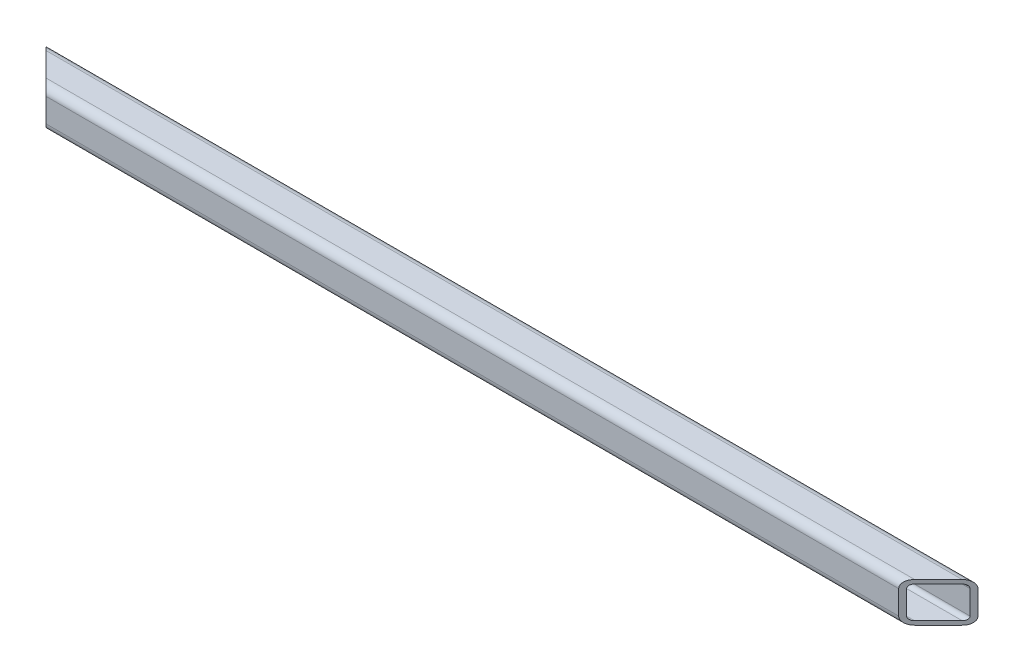
ISO-10303-21;
HEADER;
FILE_DESCRIPTION(('STEP AP214'),'2;1');
FILE_NAME('part.step','',(''),(''),'','','');
FILE_SCHEMA(('AUTOMOTIVE_DESIGN { 1 0 10303 214 1 1 1 1 }'));
ENDSEC;
DATA;
#1=APPLICATION_CONTEXT('core data for automotive mechanical design processes');
#2=APPLICATION_PROTOCOL_DEFINITION('international standard','automotive_design',2000,#1);
#3=PRODUCT_CONTEXT('',#1,'mechanical');
#4=PRODUCT('Part','Part','',(#3));
#5=PRODUCT_RELATED_PRODUCT_CATEGORY('part','',(#4));
#6=PRODUCT_DEFINITION_FORMATION('','',#4);
#7=PRODUCT_DEFINITION_CONTEXT('part definition',#1,'design');
#8=PRODUCT_DEFINITION('design','',#6,#7);
#9=PRODUCT_DEFINITION_SHAPE('','',#8);
#10=(LENGTH_UNIT() NAMED_UNIT(*) SI_UNIT(.MILLI.,.METRE.));
#11=(NAMED_UNIT(*) PLANE_ANGLE_UNIT() SI_UNIT($,.RADIAN.));
#12=(NAMED_UNIT(*) SI_UNIT($,.STERADIAN.) SOLID_ANGLE_UNIT());
#13=UNCERTAINTY_MEASURE_WITH_UNIT(LENGTH_MEASURE(1.E-05),#10,'distance_accuracy_value','');
#14=(GEOMETRIC_REPRESENTATION_CONTEXT(3) GLOBAL_UNCERTAINTY_ASSIGNED_CONTEXT((#13)) GLOBAL_UNIT_ASSIGNED_CONTEXT((#10,
#11,#12)) REPRESENTATION_CONTEXT('',''));
#15=CARTESIAN_POINT('',(0.,0.,0.));
#16=DIRECTION('',(0.,0.,1.));
#17=DIRECTION('',(1.,0.,0.));
#18=AXIS2_PLACEMENT_3D('',#15,#16,#17);
#19=CARTESIAN_POINT('',(225.,206.,-456.));
#20=DIRECTION('',(-1.,0.,0.));
#21=DIRECTION('',(0.,0.,1.));
#22=AXIS2_PLACEMENT_3D('',#19,#20,#21);
#23=CYLINDRICAL_SURFACE('',#22,4.);
#24=CARTESIAN_POINT('',(-231.,206.,-456.));
#25=DIRECTION('',(-0.707106781186548,0.,0.707106781186548));
#26=DIRECTION('',(-0.707106781186548,0.,-0.707106781186547));
#27=AXIS2_PLACEMENT_3D('',#24,#25,#26);
#28=ELLIPSE('',#27,5.65685424949239,4.);
#29=CARTESIAN_POINT('',(-231.,210.,-456.));
#30=VERTEX_POINT('',#29);
#31=CARTESIAN_POINT('',(-235.,206.,-460.));
#32=VERTEX_POINT('',#31);
#33=EDGE_CURVE('E185',#30,#32,#28,.T.);
#34=ORIENTED_EDGE('',*,*,#33,.F.);
#35=DIRECTION('',(-1.,0.,0.));
#36=VECTOR('',#35,1.);
#37=CARTESIAN_POINT('',(225.,210.,-456.));
#38=LINE('',#37,#36);
#39=CARTESIAN_POINT('',(231.,210.,-456.));
#40=VERTEX_POINT('',#39);
#41=EDGE_CURVE('E265',#40,#30,#38,.T.);
#42=ORIENTED_EDGE('',*,*,#41,.F.);
#43=CARTESIAN_POINT('',(231.,206.,-456.));
#44=DIRECTION('',(0.707106781186548,0.,0.707106781186548));
#45=DIRECTION('',(-0.707106781186548,0.,0.707106781186548));
#46=AXIS2_PLACEMENT_3D('',#43,#44,#45);
#47=ELLIPSE('',#46,5.65685424949238,4.);
#48=CARTESIAN_POINT('',(235.,206.,-460.));
#49=VERTEX_POINT('',#48);
#50=EDGE_CURVE('E176',#49,#40,#47,.T.);
#51=ORIENTED_EDGE('',*,*,#50,.F.);
#52=DIRECTION('',(-1.,0.,0.));
#53=VECTOR('',#52,1.);
#54=CARTESIAN_POINT('',(225.,206.,-460.));
#55=LINE('',#54,#53);
#56=EDGE_CURVE('E45',#49,#32,#55,.T.);
#57=ORIENTED_EDGE('',*,*,#56,.T.);
#58=EDGE_LOOP('',(#34,#42,#51,#57));
#59=FACE_BOUND('',#58,.T.);
#60=ADVANCED_FACE('F41',(#59),#23,.T.);
#61=CARTESIAN_POINT('',(225.,210.,-456.));
#62=DIRECTION('',(0.,-1.,0.));
#63=DIRECTION('',(0.,0.,-1.));
#64=AXIS2_PLACEMENT_3D('',#61,#62,#63);
#65=PLANE('',#64);
#66=DIRECTION('',(-0.707106781186548,0.,-0.707106781186547));
#67=VECTOR('',#66,1.);
#68=CARTESIAN_POINT('',(-3.,210.,-228.));
#69=LINE('',#68,#67);
#70=CARTESIAN_POINT('',(-219.,210.,-444.));
#71=VERTEX_POINT('',#70);
#72=EDGE_CURVE('E182',#71,#30,#69,.T.);
#73=ORIENTED_EDGE('',*,*,#72,.F.);
#74=DIRECTION('',(-1.,0.,0.));
#75=VECTOR('',#74,1.);
#76=CARTESIAN_POINT('',(225.,210.,-444.));
#77=LINE('',#76,#75);
#78=CARTESIAN_POINT('',(219.,210.,-444.));
#79=VERTEX_POINT('',#78);
#80=EDGE_CURVE('E263',#79,#71,#77,.T.);
#81=ORIENTED_EDGE('',*,*,#80,.F.);
#82=DIRECTION('',(-0.707106781186548,0.,0.707106781186548));
#83=VECTOR('',#82,1.);
#84=CARTESIAN_POINT('',(228.,210.,-453.));
#85=LINE('',#84,#83);
#86=EDGE_CURVE('E281',#40,#79,#85,.T.);
#87=ORIENTED_EDGE('',*,*,#86,.F.);
#88=ORIENTED_EDGE('',*,*,#41,.T.);
#89=EDGE_LOOP('',(#73,#81,#87,#88));
#90=FACE_BOUND('',#89,.T.);
#91=ADVANCED_FACE('F272',(#90),#65,.F.);
#92=CARTESIAN_POINT('',(225.,206.,-444.));
#93=DIRECTION('',(-1.,0.,0.));
#94=DIRECTION('',(0.,0.,1.));
#95=AXIS2_PLACEMENT_3D('',#92,#93,#94);
#96=CYLINDRICAL_SURFACE('',#95,4.);
#97=CARTESIAN_POINT('',(-219.,206.,-444.));
#98=DIRECTION('',(-0.707106781186548,0.,0.707106781186548));
#99=DIRECTION('',(-0.707106781186548,0.,-0.707106781186547));
#100=AXIS2_PLACEMENT_3D('',#97,#98,#99);
#101=ELLIPSE('',#100,5.65685424949239,4.);
#102=CARTESIAN_POINT('',(-215.,206.,-440.));
#103=VERTEX_POINT('',#102);
#104=EDGE_CURVE('E11',#103,#71,#101,.T.);
#105=ORIENTED_EDGE('',*,*,#104,.F.);
#106=DIRECTION('',(-1.,0.,0.));
#107=VECTOR('',#106,1.);
#108=CARTESIAN_POINT('',(225.,206.,-440.));
#109=LINE('',#108,#107);
#110=CARTESIAN_POINT('',(215.,206.,-440.));
#111=VERTEX_POINT('',#110);
#112=EDGE_CURVE('E260',#111,#103,#109,.T.);
#113=ORIENTED_EDGE('',*,*,#112,.F.);
#114=CARTESIAN_POINT('',(219.,206.,-444.));
#115=DIRECTION('',(0.707106781186548,0.,0.707106781186548));
#116=DIRECTION('',(-0.707106781186548,0.,0.707106781186548));
#117=AXIS2_PLACEMENT_3D('',#114,#115,#116);
#118=ELLIPSE('',#117,5.65685424949238,4.);
#119=EDGE_CURVE('E278',#79,#111,#118,.T.);
#120=ORIENTED_EDGE('',*,*,#119,.F.);
#121=ORIENTED_EDGE('',*,*,#80,.T.);
#122=EDGE_LOOP('',(#105,#113,#120,#121));
#123=FACE_BOUND('',#122,.T.);
#124=ADVANCED_FACE('F275',(#123),#96,.T.);
#125=CARTESIAN_POINT('',(225.,194.,-440.));
#126=DIRECTION('',(0.,0.,-1.));
#127=DIRECTION('',(-1.,0.,0.));
#128=AXIS2_PLACEMENT_3D('',#125,#126,#127);
#129=PLANE('',#128);
#130=DIRECTION('',(0.,1.,0.));
#131=VECTOR('',#130,1.);
#132=CARTESIAN_POINT('',(-215.,194.,-440.));
#133=LINE('',#132,#131);
#134=CARTESIAN_POINT('',(-215.,194.,-440.));
#135=VERTEX_POINT('',#134);
#136=EDGE_CURVE('E51',#135,#103,#133,.T.);
#137=ORIENTED_EDGE('',*,*,#136,.F.);
#138=DIRECTION('',(-1.,0.,0.));
#139=VECTOR('',#138,1.);
#140=CARTESIAN_POINT('',(225.,194.,-440.));
#141=LINE('',#140,#139);
#142=CARTESIAN_POINT('',(215.,194.,-440.));
#143=VERTEX_POINT('',#142);
#144=EDGE_CURVE('E257',#143,#135,#141,.T.);
#145=ORIENTED_EDGE('',*,*,#144,.F.);
#146=DIRECTION('',(0.,-1.,0.));
#147=VECTOR('',#146,1.);
#148=CARTESIAN_POINT('',(215.,194.,-440.));
#149=LINE('',#148,#147);
#150=EDGE_CURVE('E280',#111,#143,#149,.T.);
#151=ORIENTED_EDGE('',*,*,#150,.F.);
#152=ORIENTED_EDGE('',*,*,#112,.T.);
#153=EDGE_LOOP('',(#137,#145,#151,#152));
#154=FACE_BOUND('',#153,.T.);
#155=ADVANCED_FACE('F291',(#154),#129,.F.);
#156=CARTESIAN_POINT('',(225.,194.,-444.));
#157=DIRECTION('',(-1.,0.,0.));
#158=DIRECTION('',(0.,0.,1.));
#159=AXIS2_PLACEMENT_3D('',#156,#157,#158);
#160=CYLINDRICAL_SURFACE('',#159,4.);
#161=CARTESIAN_POINT('',(-219.,194.,-444.));
#162=DIRECTION('',(-0.707106781186548,0.,0.707106781186548));
#163=DIRECTION('',(-0.707106781186548,0.,-0.707106781186547));
#164=AXIS2_PLACEMENT_3D('',#161,#162,#163);
#165=ELLIPSE('',#164,5.65685424949239,4.);
#166=CARTESIAN_POINT('',(-219.,190.,-444.));
#167=VERTEX_POINT('',#166);
#168=EDGE_CURVE('E200',#167,#135,#165,.T.);
#169=ORIENTED_EDGE('',*,*,#168,.F.);
#170=DIRECTION('',(-1.,0.,0.));
#171=VECTOR('',#170,1.);
#172=CARTESIAN_POINT('',(225.,190.,-444.));
#173=LINE('',#172,#171);
#174=CARTESIAN_POINT('',(219.,190.,-444.));
#175=VERTEX_POINT('',#174);
#176=EDGE_CURVE('E254',#175,#167,#173,.T.);
#177=ORIENTED_EDGE('',*,*,#176,.F.);
#178=CARTESIAN_POINT('',(219.,194.,-444.));
#179=DIRECTION('',(0.707106781186548,0.,0.707106781186548));
#180=DIRECTION('',(-0.707106781186548,0.,0.707106781186548));
#181=AXIS2_PLACEMENT_3D('',#178,#179,#180);
#182=ELLIPSE('',#181,5.65685424949238,4.);
#183=EDGE_CURVE('E187',#143,#175,#182,.T.);
#184=ORIENTED_EDGE('',*,*,#183,.F.);
#185=ORIENTED_EDGE('',*,*,#144,.T.);
#186=EDGE_LOOP('',(#169,#177,#184,#185));
#187=FACE_BOUND('',#186,.T.);
#188=ADVANCED_FACE('F289',(#187),#160,.T.);
#189=CARTESIAN_POINT('',(225.,190.,-444.));
#190=DIRECTION('',(0.,1.,0.));
#191=DIRECTION('',(0.,0.,1.));
#192=AXIS2_PLACEMENT_3D('',#189,#190,#191);
#193=PLANE('',#192);
#194=DIRECTION('',(0.707106781186548,0.,0.707106781186547));
#195=VECTOR('',#194,1.);
#196=CARTESIAN_POINT('',(2.99999999999997,190.,-222.));
#197=LINE('',#196,#195);
#198=CARTESIAN_POINT('',(-231.,190.,-456.));
#199=VERTEX_POINT('',#198);
#200=EDGE_CURVE('E203',#199,#167,#197,.T.);
#201=ORIENTED_EDGE('',*,*,#200,.F.);
#202=DIRECTION('',(-1.,0.,0.));
#203=VECTOR('',#202,1.);
#204=CARTESIAN_POINT('',(225.,190.,-456.));
#205=LINE('',#204,#203);
#206=CARTESIAN_POINT('',(231.,190.,-456.));
#207=VERTEX_POINT('',#206);
#208=EDGE_CURVE('E252',#207,#199,#205,.T.);
#209=ORIENTED_EDGE('',*,*,#208,.F.);
#210=DIRECTION('',(0.707106781186548,0.,-0.707106781186548));
#211=VECTOR('',#210,1.);
#212=CARTESIAN_POINT('',(222.,190.,-447.));
#213=LINE('',#212,#211);
#214=EDGE_CURVE('E181',#175,#207,#213,.T.);
#215=ORIENTED_EDGE('',*,*,#214,.F.);
#216=ORIENTED_EDGE('',*,*,#176,.T.);
#217=EDGE_LOOP('',(#201,#209,#215,#216));
#218=FACE_BOUND('',#217,.T.);
#219=ADVANCED_FACE('F293',(#218),#193,.F.);
#220=CARTESIAN_POINT('',(225.,194.,-456.));
#221=DIRECTION('',(-1.,0.,0.));
#222=DIRECTION('',(0.,0.,1.));
#223=AXIS2_PLACEMENT_3D('',#220,#221,#222);
#224=CYLINDRICAL_SURFACE('',#223,4.);
#225=CARTESIAN_POINT('',(-231.,194.,-456.));
#226=DIRECTION('',(-0.707106781186548,0.,0.707106781186548));
#227=DIRECTION('',(-0.707106781186548,0.,-0.707106781186547));
#228=AXIS2_PLACEMENT_3D('',#225,#226,#227);
#229=ELLIPSE('',#228,5.65685424949239,4.);
#230=CARTESIAN_POINT('',(-235.,194.,-460.));
#231=VERTEX_POINT('',#230);
#232=EDGE_CURVE('E164',#231,#199,#229,.T.);
#233=ORIENTED_EDGE('',*,*,#232,.F.);
#234=DIRECTION('',(-1.,0.,0.));
#235=VECTOR('',#234,1.);
#236=CARTESIAN_POINT('',(225.,194.,-460.));
#237=LINE('',#236,#235);
#238=CARTESIAN_POINT('',(235.,194.,-460.));
#239=VERTEX_POINT('',#238);
#240=EDGE_CURVE('E156',#239,#231,#237,.T.);
#241=ORIENTED_EDGE('',*,*,#240,.F.);
#242=CARTESIAN_POINT('',(231.,194.,-456.));
#243=DIRECTION('',(0.707106781186548,0.,0.707106781186548));
#244=DIRECTION('',(-0.707106781186548,0.,0.707106781186548));
#245=AXIS2_PLACEMENT_3D('',#242,#243,#244);
#246=ELLIPSE('',#245,5.65685424949238,4.);
#247=EDGE_CURVE('E161',#207,#239,#246,.T.);
#248=ORIENTED_EDGE('',*,*,#247,.F.);
#249=ORIENTED_EDGE('',*,*,#208,.T.);
#250=EDGE_LOOP('',(#233,#241,#248,#249));
#251=FACE_BOUND('',#250,.T.);
#252=ADVANCED_FACE('F158',(#251),#224,.T.);
#253=CARTESIAN_POINT('',(225.,206.,-444.));
#254=DIRECTION('',(-1.,0.,0.));
#255=DIRECTION('',(0.,0.,1.));
#256=AXIS2_PLACEMENT_3D('',#253,#254,#255);
#257=CYLINDRICAL_SURFACE('',#256,2.);
#258=DIRECTION('',(-1.,0.,0.));
#259=VECTOR('',#258,1.);
#260=CARTESIAN_POINT('',(225.,206.,-442.));
#261=LINE('',#260,#259);
#262=CARTESIAN_POINT('',(217.,206.,-442.));
#263=VERTEX_POINT('',#262);
#264=CARTESIAN_POINT('',(-217.,206.,-442.));
#265=VERTEX_POINT('',#264);
#266=EDGE_CURVE('E209',#263,#265,#261,.T.);
#267=ORIENTED_EDGE('',*,*,#266,.T.);
#268=CARTESIAN_POINT('',(-219.,206.,-444.));
#269=DIRECTION('',(-0.707106781186548,0.,0.707106781186548));
#270=DIRECTION('',(-0.707106781186548,0.,-0.707106781186547));
#271=AXIS2_PLACEMENT_3D('',#268,#269,#270);
#272=ELLIPSE('',#271,2.82842712474619,2.);
#273=CARTESIAN_POINT('',(-219.,208.,-444.));
#274=VERTEX_POINT('',#273);
#275=EDGE_CURVE('E87',#265,#274,#272,.T.);
#276=ORIENTED_EDGE('',*,*,#275,.T.);
#277=DIRECTION('',(-1.,0.,0.));
#278=VECTOR('',#277,1.);
#279=CARTESIAN_POINT('',(225.,208.,-444.));
#280=LINE('',#279,#278);
#281=CARTESIAN_POINT('',(219.,208.,-444.));
#282=VERTEX_POINT('',#281);
#283=EDGE_CURVE('E212',#282,#274,#280,.T.);
#284=ORIENTED_EDGE('',*,*,#283,.F.);
#285=CARTESIAN_POINT('',(219.,206.,-444.));
#286=DIRECTION('',(0.707106781186548,0.,0.707106781186548));
#287=DIRECTION('',(-0.707106781186548,0.,0.707106781186548));
#288=AXIS2_PLACEMENT_3D('',#285,#286,#287);
#289=ELLIPSE('',#288,2.82842712474619,2.);
#290=EDGE_CURVE('E208',#282,#263,#289,.T.);
#291=ORIENTED_EDGE('',*,*,#290,.T.);
#292=EDGE_LOOP('',(#267,#276,#284,#291));
#293=FACE_BOUND('',#292,.T.);
#294=ADVANCED_FACE('F300',(#293),#257,.F.);
#295=CARTESIAN_POINT('',(225.,208.,-456.));
#296=DIRECTION('',(0.,-1.,0.));
#297=DIRECTION('',(0.,0.,-1.));
#298=AXIS2_PLACEMENT_3D('',#295,#296,#297);
#299=PLANE('',#298);
#300=ORIENTED_EDGE('',*,*,#283,.T.);
#301=DIRECTION('',(-0.707106781186548,0.,-0.707106781186547));
#302=VECTOR('',#301,1.);
#303=CARTESIAN_POINT('',(-3.,208.,-228.));
#304=LINE('',#303,#302);
#305=CARTESIAN_POINT('',(-231.,208.,-456.));
#306=VERTEX_POINT('',#305);
#307=EDGE_CURVE('E60',#274,#306,#304,.T.);
#308=ORIENTED_EDGE('',*,*,#307,.T.);
#309=DIRECTION('',(-1.,0.,0.));
#310=VECTOR('',#309,1.);
#311=CARTESIAN_POINT('',(225.,208.,-456.));
#312=LINE('',#311,#310);
#313=CARTESIAN_POINT('',(231.,208.,-456.));
#314=VERTEX_POINT('',#313);
#315=EDGE_CURVE('E217',#314,#306,#312,.T.);
#316=ORIENTED_EDGE('',*,*,#315,.F.);
#317=DIRECTION('',(-0.707106781186548,0.,0.707106781186548));
#318=VECTOR('',#317,1.);
#319=CARTESIAN_POINT('',(228.,208.,-453.));
#320=LINE('',#319,#318);
#321=EDGE_CURVE('E211',#314,#282,#320,.T.);
#322=ORIENTED_EDGE('',*,*,#321,.T.);
#323=EDGE_LOOP('',(#300,#308,#316,#322));
#324=FACE_BOUND('',#323,.T.);
#325=ADVANCED_FACE('F342',(#324),#299,.T.);
#326=CARTESIAN_POINT('',(225.,206.,-456.));
#327=DIRECTION('',(-1.,0.,0.));
#328=DIRECTION('',(0.,0.,1.));
#329=AXIS2_PLACEMENT_3D('',#326,#327,#328);
#330=CYLINDRICAL_SURFACE('',#329,2.);
#331=ORIENTED_EDGE('',*,*,#315,.T.);
#332=CARTESIAN_POINT('',(-231.,206.,-456.));
#333=DIRECTION('',(-0.707106781186548,0.,0.707106781186548));
#334=DIRECTION('',(-0.707106781186548,0.,-0.707106781186547));
#335=AXIS2_PLACEMENT_3D('',#332,#333,#334);
#336=ELLIPSE('',#335,2.82842712474619,2.);
#337=CARTESIAN_POINT('',(-233.,206.,-458.));
#338=VERTEX_POINT('',#337);
#339=EDGE_CURVE('E213',#306,#338,#336,.T.);
#340=ORIENTED_EDGE('',*,*,#339,.T.);
#341=DIRECTION('',(-1.,0.,0.));
#342=VECTOR('',#341,1.);
#343=CARTESIAN_POINT('',(225.,206.,-458.));
#344=LINE('',#343,#342);
#345=CARTESIAN_POINT('',(233.,206.,-458.));
#346=VERTEX_POINT('',#345);
#347=EDGE_CURVE('E222',#346,#338,#344,.T.);
#348=ORIENTED_EDGE('',*,*,#347,.F.);
#349=CARTESIAN_POINT('',(231.,206.,-456.));
#350=DIRECTION('',(0.707106781186548,0.,0.707106781186548));
#351=DIRECTION('',(-0.707106781186548,0.,0.707106781186548));
#352=AXIS2_PLACEMENT_3D('',#349,#350,#351);
#353=ELLIPSE('',#352,2.82842712474619,2.);
#354=EDGE_CURVE('E216',#346,#314,#353,.T.);
#355=ORIENTED_EDGE('',*,*,#354,.T.);
#356=EDGE_LOOP('',(#331,#340,#348,#355));
#357=FACE_BOUND('',#356,.T.);
#358=ADVANCED_FACE('F352',(#357),#330,.F.);
#359=CARTESIAN_POINT('',(225.,206.,-458.));
#360=DIRECTION('',(0.,0.,1.));
#361=DIRECTION('',(1.,0.,0.));
#362=AXIS2_PLACEMENT_3D('',#359,#360,#361);
#363=PLANE('',#362);
#364=ORIENTED_EDGE('',*,*,#347,.T.);
#365=DIRECTION('',(0.,-1.,0.));
#366=VECTOR('',#365,1.);
#367=CARTESIAN_POINT('',(-233.,206.,-458.));
#368=LINE('',#367,#366);
#369=CARTESIAN_POINT('',(-233.,194.,-458.));
#370=VERTEX_POINT('',#369);
#371=EDGE_CURVE('E218',#338,#370,#368,.T.);
#372=ORIENTED_EDGE('',*,*,#371,.T.);
#373=DIRECTION('',(-1.,0.,0.));
#374=VECTOR('',#373,1.);
#375=CARTESIAN_POINT('',(225.,194.,-458.));
#376=LINE('',#375,#374);
#377=CARTESIAN_POINT('',(233.,194.,-458.));
#378=VERTEX_POINT('',#377);
#379=EDGE_CURVE('E227',#378,#370,#376,.T.);
#380=ORIENTED_EDGE('',*,*,#379,.F.);
#381=DIRECTION('',(0.,1.,0.));
#382=VECTOR('',#381,1.);
#383=CARTESIAN_POINT('',(233.,206.,-458.));
#384=LINE('',#383,#382);
#385=EDGE_CURVE('E221',#378,#346,#384,.T.);
#386=ORIENTED_EDGE('',*,*,#385,.T.);
#387=EDGE_LOOP('',(#364,#372,#380,#386));
#388=FACE_BOUND('',#387,.T.);
#389=ADVANCED_FACE('F362',(#388),#363,.T.);
#390=CARTESIAN_POINT('',(225.,194.,-456.));
#391=DIRECTION('',(-1.,0.,0.));
#392=DIRECTION('',(0.,0.,1.));
#393=AXIS2_PLACEMENT_3D('',#390,#391,#392);
#394=CYLINDRICAL_SURFACE('',#393,2.);
#395=ORIENTED_EDGE('',*,*,#379,.T.);
#396=CARTESIAN_POINT('',(-231.,194.,-456.));
#397=DIRECTION('',(-0.707106781186548,0.,0.707106781186548));
#398=DIRECTION('',(-0.707106781186548,0.,-0.707106781186547));
#399=AXIS2_PLACEMENT_3D('',#396,#397,#398);
#400=ELLIPSE('',#399,2.82842712474619,2.);
#401=CARTESIAN_POINT('',(-231.,192.,-456.));
#402=VERTEX_POINT('',#401);
#403=EDGE_CURVE('E223',#370,#402,#400,.T.);
#404=ORIENTED_EDGE('',*,*,#403,.T.);
#405=DIRECTION('',(-1.,0.,0.));
#406=VECTOR('',#405,1.);
#407=CARTESIAN_POINT('',(225.,192.,-456.));
#408=LINE('',#407,#406);
#409=CARTESIAN_POINT('',(231.,192.,-456.));
#410=VERTEX_POINT('',#409);
#411=EDGE_CURVE('E232',#410,#402,#408,.T.);
#412=ORIENTED_EDGE('',*,*,#411,.F.);
#413=CARTESIAN_POINT('',(231.,194.,-456.));
#414=DIRECTION('',(0.707106781186548,0.,0.707106781186548));
#415=DIRECTION('',(-0.707106781186548,0.,0.707106781186548));
#416=AXIS2_PLACEMENT_3D('',#413,#414,#415);
#417=ELLIPSE('',#416,2.82842712474619,2.);
#418=EDGE_CURVE('E226',#410,#378,#417,.T.);
#419=ORIENTED_EDGE('',*,*,#418,.T.);
#420=EDGE_LOOP('',(#395,#404,#412,#419));
#421=FACE_BOUND('',#420,.T.);
#422=ADVANCED_FACE('F372',(#421),#394,.F.);
#423=CARTESIAN_POINT('',(225.,192.,-444.));
#424=DIRECTION('',(0.,1.,0.));
#425=DIRECTION('',(0.,0.,1.));
#426=AXIS2_PLACEMENT_3D('',#423,#424,#425);
#427=PLANE('',#426);
#428=ORIENTED_EDGE('',*,*,#411,.T.);
#429=DIRECTION('',(0.707106781186548,0.,0.707106781186547));
#430=VECTOR('',#429,1.);
#431=CARTESIAN_POINT('',(2.99999999999998,192.,-222.));
#432=LINE('',#431,#430);
#433=CARTESIAN_POINT('',(-219.,192.,-444.));
#434=VERTEX_POINT('',#433);
#435=EDGE_CURVE('E228',#402,#434,#432,.T.);
#436=ORIENTED_EDGE('',*,*,#435,.T.);
#437=DIRECTION('',(-1.,0.,0.));
#438=VECTOR('',#437,1.);
#439=CARTESIAN_POINT('',(225.,192.,-444.));
#440=LINE('',#439,#438);
#441=CARTESIAN_POINT('',(219.,192.,-444.));
#442=VERTEX_POINT('',#441);
#443=EDGE_CURVE('E236',#442,#434,#440,.T.);
#444=ORIENTED_EDGE('',*,*,#443,.F.);
#445=DIRECTION('',(0.707106781186548,0.,-0.707106781186548));
#446=VECTOR('',#445,1.);
#447=CARTESIAN_POINT('',(222.,192.,-447.));
#448=LINE('',#447,#446);
#449=EDGE_CURVE('E231',#442,#410,#448,.T.);
#450=ORIENTED_EDGE('',*,*,#449,.T.);
#451=EDGE_LOOP('',(#428,#436,#444,#450));
#452=FACE_BOUND('',#451,.T.);
#453=ADVANCED_FACE('F382',(#452),#427,.T.);
#454=CARTESIAN_POINT('',(225.,194.,-444.));
#455=DIRECTION('',(-1.,0.,0.));
#456=DIRECTION('',(0.,0.,1.));
#457=AXIS2_PLACEMENT_3D('',#454,#455,#456);
#458=CYLINDRICAL_SURFACE('',#457,2.);
#459=ORIENTED_EDGE('',*,*,#443,.T.);
#460=CARTESIAN_POINT('',(-219.,194.,-444.));
#461=DIRECTION('',(-0.707106781186548,0.,0.707106781186548));
#462=DIRECTION('',(-0.707106781186548,0.,-0.707106781186547));
#463=AXIS2_PLACEMENT_3D('',#460,#461,#462);
#464=ELLIPSE('',#463,2.82842712474619,2.);
#465=CARTESIAN_POINT('',(-217.,194.,-442.));
#466=VERTEX_POINT('',#465);
#467=EDGE_CURVE('E233',#434,#466,#464,.T.);
#468=ORIENTED_EDGE('',*,*,#467,.T.);
#469=DIRECTION('',(-1.,0.,0.));
#470=VECTOR('',#469,1.);
#471=CARTESIAN_POINT('',(225.,194.,-442.));
#472=LINE('',#471,#470);
#473=CARTESIAN_POINT('',(217.,194.,-442.));
#474=VERTEX_POINT('',#473);
#475=EDGE_CURVE('E194',#474,#466,#472,.T.);
#476=ORIENTED_EDGE('',*,*,#475,.F.);
#477=CARTESIAN_POINT('',(219.,194.,-444.));
#478=DIRECTION('',(0.707106781186548,0.,0.707106781186548));
#479=DIRECTION('',(-0.707106781186548,0.,0.707106781186548));
#480=AXIS2_PLACEMENT_3D('',#477,#478,#479);
#481=ELLIPSE('',#480,2.82842712474619,2.);
#482=EDGE_CURVE('E235',#474,#442,#481,.T.);
#483=ORIENTED_EDGE('',*,*,#482,.T.);
#484=EDGE_LOOP('',(#459,#468,#476,#483));
#485=FACE_BOUND('',#484,.T.);
#486=ADVANCED_FACE('F392',(#485),#458,.F.);
#487=CARTESIAN_POINT('',(225.,194.,-442.));
#488=DIRECTION('',(0.,0.,-1.));
#489=DIRECTION('',(-1.,0.,0.));
#490=AXIS2_PLACEMENT_3D('',#487,#488,#489);
#491=PLANE('',#490);
#492=ORIENTED_EDGE('',*,*,#475,.T.);
#493=DIRECTION('',(0.,1.,0.));
#494=VECTOR('',#493,1.);
#495=CARTESIAN_POINT('',(-217.,194.,-442.));
#496=LINE('',#495,#494);
#497=EDGE_CURVE('E82',#466,#265,#496,.T.);
#498=ORIENTED_EDGE('',*,*,#497,.T.);
#499=ORIENTED_EDGE('',*,*,#266,.F.);
#500=DIRECTION('',(0.,-1.,0.));
#501=VECTOR('',#500,1.);
#502=CARTESIAN_POINT('',(217.,194.,-442.));
#503=LINE('',#502,#501);
#504=EDGE_CURVE('E169',#263,#474,#503,.T.);
#505=ORIENTED_EDGE('',*,*,#504,.T.);
#506=EDGE_LOOP('',(#492,#498,#499,#505));
#507=FACE_BOUND('',#506,.T.);
#508=ADVANCED_FACE('F402',(#507),#491,.T.);
#509=CARTESIAN_POINT('',(225.,206.,-460.));
#510=DIRECTION('',(0.,0.,1.));
#511=DIRECTION('',(1.,0.,0.));
#512=AXIS2_PLACEMENT_3D('',#509,#510,#511);
#513=PLANE('',#512);
#514=DIRECTION('',(0.,-1.,0.));
#515=VECTOR('',#514,1.);
#516=CARTESIAN_POINT('',(-235.,206.,-460.));
#517=LINE('',#516,#515);
#518=EDGE_CURVE('E196',#32,#231,#517,.T.);
#519=ORIENTED_EDGE('',*,*,#518,.F.);
#520=ORIENTED_EDGE('',*,*,#56,.F.);
#521=DIRECTION('',(0.,1.,0.));
#522=VECTOR('',#521,1.);
#523=CARTESIAN_POINT('',(235.,206.,-460.));
#524=LINE('',#523,#522);
#525=EDGE_CURVE('E168',#239,#49,#524,.T.);
#526=ORIENTED_EDGE('',*,*,#525,.F.);
#527=ORIENTED_EDGE('',*,*,#240,.T.);
#528=EDGE_LOOP('',(#519,#520,#526,#527));
#529=FACE_BOUND('',#528,.T.);
#530=ADVANCED_FACE('F172',(#529),#513,.F.);
#531=CARTESIAN_POINT('',(225.,200.,-450.));
#532=DIRECTION('',(0.707106781186548,0.,0.707106781186548));
#533=DIRECTION('',(0.707106781186548,0.,-0.707106781186548));
#534=AXIS2_PLACEMENT_3D('',#531,#532,#533);
#535=PLANE('',#534);
#536=ORIENTED_EDGE('',*,*,#290,.F.);
#537=ORIENTED_EDGE('',*,*,#321,.F.);
#538=ORIENTED_EDGE('',*,*,#354,.F.);
#539=ORIENTED_EDGE('',*,*,#385,.F.);
#540=ORIENTED_EDGE('',*,*,#418,.F.);
#541=ORIENTED_EDGE('',*,*,#449,.F.);
#542=ORIENTED_EDGE('',*,*,#482,.F.);
#543=ORIENTED_EDGE('',*,*,#504,.F.);
#544=EDGE_LOOP('',(#536,#537,#538,#539,#540,#541,#542,#543));
#545=FACE_BOUND('',#544,.T.);
#546=ORIENTED_EDGE('',*,*,#525,.T.);
#547=ORIENTED_EDGE('',*,*,#50,.T.);
#548=ORIENTED_EDGE('',*,*,#86,.T.);
#549=ORIENTED_EDGE('',*,*,#119,.T.);
#550=ORIENTED_EDGE('',*,*,#150,.T.);
#551=ORIENTED_EDGE('',*,*,#183,.T.);
#552=ORIENTED_EDGE('',*,*,#214,.T.);
#553=ORIENTED_EDGE('',*,*,#247,.T.);
#554=EDGE_LOOP('',(#546,#547,#548,#549,#550,#551,#552,#553));
#555=FACE_BOUND('',#554,.T.);
#556=ADVANCED_FACE('F179',(#545,#555),#535,.T.);
#557=CARTESIAN_POINT('',(-225.,200.,-450.));
#558=DIRECTION('',(-0.707106781186548,0.,0.707106781186548));
#559=DIRECTION('',(0.707106781186548,0.,0.707106781186547));
#560=AXIS2_PLACEMENT_3D('',#557,#558,#559);
#561=PLANE('',#560);
#562=ORIENTED_EDGE('',*,*,#275,.F.);
#563=ORIENTED_EDGE('',*,*,#497,.F.);
#564=ORIENTED_EDGE('',*,*,#467,.F.);
#565=ORIENTED_EDGE('',*,*,#435,.F.);
#566=ORIENTED_EDGE('',*,*,#403,.F.);
#567=ORIENTED_EDGE('',*,*,#371,.F.);
#568=ORIENTED_EDGE('',*,*,#339,.F.);
#569=ORIENTED_EDGE('',*,*,#307,.F.);
#570=EDGE_LOOP('',(#562,#563,#564,#565,#566,#567,#568,#569));
#571=FACE_BOUND('',#570,.T.);
#572=ORIENTED_EDGE('',*,*,#72,.T.);
#573=ORIENTED_EDGE('',*,*,#33,.T.);
#574=ORIENTED_EDGE('',*,*,#518,.T.);
#575=ORIENTED_EDGE('',*,*,#232,.T.);
#576=ORIENTED_EDGE('',*,*,#200,.T.);
#577=ORIENTED_EDGE('',*,*,#168,.T.);
#578=ORIENTED_EDGE('',*,*,#136,.T.);
#579=ORIENTED_EDGE('',*,*,#104,.T.);
#580=EDGE_LOOP('',(#572,#573,#574,#575,#576,#577,#578,#579));
#581=FACE_BOUND('',#580,.T.);
#582=ADVANCED_FACE('F43',(#571,#581),#561,.T.);
#583=CLOSED_SHELL('',(#60,#91,#124,#155,#188,#219,#252,#294,#325,#358,#389,#422,#453,#486,#508,
#530,#556,#582));
#584=MANIFOLD_SOLID_BREP('B2',#583);
#585=ADVANCED_BREP_SHAPE_REPRESENTATION('',(#18,#584),#14);
#586=SHAPE_DEFINITION_REPRESENTATION(#9,#585);
ENDSEC;
END-ISO-10303-21;
